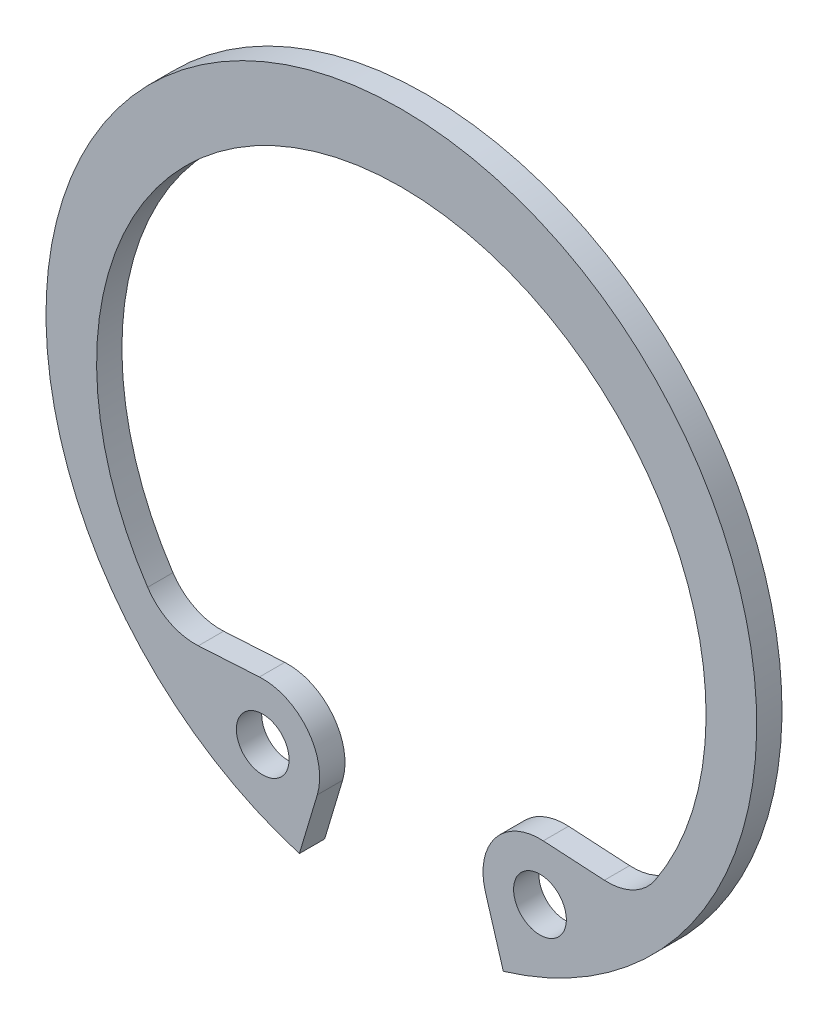
ISO-10303-21;
HEADER;
FILE_DESCRIPTION(('STEP AP214'),'2;1');
FILE_NAME('part.step','',(''),(''),'','','');
FILE_SCHEMA(('AUTOMOTIVE_DESIGN { 1 0 10303 214 1 1 1 1 }'));
ENDSEC;
DATA;
#1=APPLICATION_CONTEXT('core data for automotive mechanical design processes');
#2=APPLICATION_PROTOCOL_DEFINITION('international standard','automotive_design',2000,#1);
#3=PRODUCT_CONTEXT('',#1,'mechanical');
#4=PRODUCT('Part','Part','',(#3));
#5=PRODUCT_RELATED_PRODUCT_CATEGORY('part','',(#4));
#6=PRODUCT_DEFINITION_FORMATION('','',#4);
#7=PRODUCT_DEFINITION_CONTEXT('part definition',#1,'design');
#8=PRODUCT_DEFINITION('design','',#6,#7);
#9=PRODUCT_DEFINITION_SHAPE('','',#8);
#10=(LENGTH_UNIT() NAMED_UNIT(*) SI_UNIT(.MILLI.,.METRE.));
#11=(NAMED_UNIT(*) PLANE_ANGLE_UNIT() SI_UNIT($,.RADIAN.));
#12=(NAMED_UNIT(*) SI_UNIT($,.STERADIAN.) SOLID_ANGLE_UNIT());
#13=UNCERTAINTY_MEASURE_WITH_UNIT(LENGTH_MEASURE(1.E-05),#10,'distance_accuracy_value','');
#14=(GEOMETRIC_REPRESENTATION_CONTEXT(3) GLOBAL_UNCERTAINTY_ASSIGNED_CONTEXT((#13)) GLOBAL_UNIT_ASSIGNED_CONTEXT((#10,
#11,#12)) REPRESENTATION_CONTEXT('',''));
#15=CARTESIAN_POINT('',(0.,0.,0.));
#16=DIRECTION('',(0.,0.,1.));
#17=DIRECTION('',(1.,0.,0.));
#18=AXIS2_PLACEMENT_3D('',#15,#16,#17);
#19=CARTESIAN_POINT('',(0.,0.,0.));
#20=DIRECTION('',(0.,0.,1.));
#21=DIRECTION('',(0.999999999999999,0.,0.));
#22=AXIS2_PLACEMENT_3D('',#19,#20,#21);
#23=PLANE('',#22);
#24=CARTESIAN_POINT('',(6.57243608662109,-12.5309849527992,0.));
#25=DIRECTION('',(0.,0.,1.));
#26=DIRECTION('',(0.999999999999999,0.,0.));
#27=AXIS2_PLACEMENT_3D('',#24,#25,#26);
#28=CIRCLE('',#27,1.25);
#29=CARTESIAN_POINT('',(5.3224360866211,-12.5309849527992,0.));
#30=VERTEX_POINT('',#29);
#31=EDGE_CURVE('E130',#30,#30,#28,.T.);
#32=ORIENTED_EDGE('',*,*,#31,.T.);
#33=EDGE_LOOP('',(#32));
#34=FACE_BOUND('',#33,.T.);
#35=CARTESIAN_POINT('',(0.,0.,0.));
#36=DIRECTION('',(0.,0.,1.));
#37=DIRECTION('',(0.999999999999999,0.,0.));
#38=AXIS2_PLACEMENT_3D('',#35,#36,#37);
#39=CIRCLE('',#38,16.85);
#40=CARTESIAN_POINT('',(4.83542107768737,-16.1412887651964,0.));
#41=VERTEX_POINT('',#40);
#42=CARTESIAN_POINT('',(-4.83542107768737,-16.1412887651964,0.));
#43=VERTEX_POINT('',#42);
#44=EDGE_CURVE('E113',#41,#43,#39,.T.);
#45=ORIENTED_EDGE('',*,*,#44,.F.);
#46=DIRECTION('',(0.286968609951774,-0.957939986065069,0.));
#47=VECTOR('',#46,1.);
#48=CARTESIAN_POINT('',(3.9859981242454,-13.305800199669,0.));
#49=LINE('',#48,#47);
#50=CARTESIAN_POINT('',(3.9859981242454,-13.305800199669,0.));
#51=VERTEX_POINT('',#50);
#52=EDGE_CURVE('E147',#51,#41,#49,.T.);
#53=ORIENTED_EDGE('',*,*,#52,.F.);
#54=CARTESIAN_POINT('',(6.57243608662109,-12.5309849527992,0.));
#55=DIRECTION('',(0.,0.,1.));
#56=DIRECTION('',(0.999999999999999,0.,0.));
#57=AXIS2_PLACEMENT_3D('',#54,#55,#56);
#58=CIRCLE('',#57,2.7);
#59=CARTESIAN_POINT('',(6.72896179925984,-9.83552586364894,0.));
#60=VERTEX_POINT('',#59);
#61=EDGE_CURVE('E145',#60,#51,#58,.T.);
#62=ORIENTED_EDGE('',*,*,#61,.F.);
#63=DIRECTION('',(-0.998318181166775,0.0579724861624974,0.));
#64=VECTOR('',#63,1.);
#65=CARTESIAN_POINT('',(9.62633191884148,-10.0037765800375,0.));
#66=LINE('',#65,#64);
#67=CARTESIAN_POINT('',(9.62633191884148,-10.0037765800375,0.));
#68=VERTEX_POINT('',#67);
#69=EDGE_CURVE('E143',#68,#60,#66,.T.);
#70=ORIENTED_EDGE('',*,*,#69,.F.);
#71=CARTESIAN_POINT('',(9.78285763148023,-7.30831749088726,0.));
#72=DIRECTION('',(0.,0.,-1.));
#73=DIRECTION('',(0.999999999999999,0.,0.));
#74=AXIS2_PLACEMENT_3D('',#71,#72,#73);
#75=CIRCLE('',#74,2.7);
#76=CARTESIAN_POINT('',(12.0308334276501,-8.80384576538901,0.));
#77=VERTEX_POINT('',#76);
#78=EDGE_CURVE('E141',#77,#68,#75,.T.);
#79=ORIENTED_EDGE('',*,*,#78,.F.);
#80=CARTESIAN_POINT('',(0.,-0.799999999999995,0.));
#81=DIRECTION('',(0.,0.,-1.));
#82=DIRECTION('',(0.999999999999999,0.,0.));
#83=AXIS2_PLACEMENT_3D('',#80,#81,#82);
#84=CIRCLE('',#83,14.45);
#85=CARTESIAN_POINT('',(-12.0308334276501,-8.80384576538901,0.));
#86=VERTEX_POINT('',#85);
#87=EDGE_CURVE('E139',#86,#77,#84,.T.);
#88=ORIENTED_EDGE('',*,*,#87,.F.);
#89=CARTESIAN_POINT('',(-9.78285763148023,-7.30831749088726,0.));
#90=DIRECTION('',(0.,0.,-1.));
#91=DIRECTION('',(-0.999999999999999,0.,0.));
#92=AXIS2_PLACEMENT_3D('',#89,#90,#91);
#93=CIRCLE('',#92,2.7);
#94=CARTESIAN_POINT('',(-9.62633191884148,-10.0037765800376,0.));
#95=VERTEX_POINT('',#94);
#96=EDGE_CURVE('E137',#95,#86,#93,.T.);
#97=ORIENTED_EDGE('',*,*,#96,.F.);
#98=DIRECTION('',(-0.998318181166775,-0.0579724861624974,0.));
#99=VECTOR('',#98,1.);
#100=CARTESIAN_POINT('',(-9.62633191884148,-10.0037765800376,0.));
#101=LINE('',#100,#99);
#102=CARTESIAN_POINT('',(-6.72896179925983,-9.83552586364894,0.));
#103=VERTEX_POINT('',#102);
#104=EDGE_CURVE('E135',#103,#95,#101,.T.);
#105=ORIENTED_EDGE('',*,*,#104,.F.);
#106=CARTESIAN_POINT('',(-6.57243608662109,-12.5309849527992,0.));
#107=DIRECTION('',(0.,0.,1.));
#108=DIRECTION('',(-0.999999999999999,0.,0.));
#109=AXIS2_PLACEMENT_3D('',#106,#107,#108);
#110=CIRCLE('',#109,2.7);
#111=CARTESIAN_POINT('',(-3.98599812424541,-13.305800199669,0.));
#112=VERTEX_POINT('',#111);
#113=EDGE_CURVE('E115',#112,#103,#110,.T.);
#114=ORIENTED_EDGE('',*,*,#113,.F.);
#115=DIRECTION('',(0.286968609951774,0.957939986065069,0.));
#116=VECTOR('',#115,1.);
#117=CARTESIAN_POINT('',(-3.9859981242454,-13.305800199669,0.));
#118=LINE('',#117,#116);
#119=EDGE_CURVE('E109',#43,#112,#118,.T.);
#120=ORIENTED_EDGE('',*,*,#119,.F.);
#121=EDGE_LOOP('',(#45,#53,#62,#70,#79,#88,#97,#105,#114,#120));
#122=FACE_BOUND('',#121,.T.);
#123=CARTESIAN_POINT('',(-6.57243608662109,-12.5309849527992,0.));
#124=DIRECTION('',(0.,0.,1.));
#125=DIRECTION('',(-0.999999999999999,0.,0.));
#126=AXIS2_PLACEMENT_3D('',#123,#124,#125);
#127=CIRCLE('',#126,1.25);
#128=CARTESIAN_POINT('',(-7.82243608662109,-12.5309849527992,0.));
#129=VERTEX_POINT('',#128);
#130=EDGE_CURVE('E253',#129,#129,#127,.T.);
#131=ORIENTED_EDGE('',*,*,#130,.T.);
#132=EDGE_LOOP('',(#131));
#133=FACE_BOUND('',#132,.T.);
#134=ADVANCED_FACE('F32',(#34,#122,#133),#23,.F.);
#135=CARTESIAN_POINT('',(0.,0.,1.2));
#136=DIRECTION('',(0.,0.,1.));
#137=DIRECTION('',(0.999999999999999,0.,0.));
#138=AXIS2_PLACEMENT_3D('',#135,#136,#137);
#139=PLANE('',#138);
#140=CARTESIAN_POINT('',(6.57243608662109,-12.5309849527992,1.2));
#141=DIRECTION('',(0.,0.,1.));
#142=DIRECTION('',(0.999999999999999,0.,0.));
#143=AXIS2_PLACEMENT_3D('',#140,#141,#142);
#144=CIRCLE('',#143,1.25);
#145=CARTESIAN_POINT('',(5.3224360866211,-12.5309849527992,1.2));
#146=VERTEX_POINT('',#145);
#147=EDGE_CURVE('E127',#146,#146,#144,.T.);
#148=ORIENTED_EDGE('',*,*,#147,.F.);
#149=EDGE_LOOP('',(#148));
#150=FACE_BOUND('',#149,.T.);
#151=CARTESIAN_POINT('',(0.,0.,1.2));
#152=DIRECTION('',(0.,0.,1.));
#153=DIRECTION('',(0.999999999999999,0.,0.));
#154=AXIS2_PLACEMENT_3D('',#151,#152,#153);
#155=CIRCLE('',#154,16.85);
#156=CARTESIAN_POINT('',(4.83542107768737,-16.1412887651964,1.2));
#157=VERTEX_POINT('',#156);
#158=CARTESIAN_POINT('',(-4.83542107768737,-16.1412887651964,1.19999999999999));
#159=VERTEX_POINT('',#158);
#160=EDGE_CURVE('E149',#157,#159,#155,.T.);
#161=ORIENTED_EDGE('',*,*,#160,.T.);
#162=DIRECTION('',(0.286968609951774,0.957939986065069,0.));
#163=VECTOR('',#162,1.);
#164=CARTESIAN_POINT('',(-3.9859981242454,-13.305800199669,1.2));
#165=LINE('',#164,#163);
#166=CARTESIAN_POINT('',(-3.98599812424541,-13.305800199669,1.2));
#167=VERTEX_POINT('',#166);
#168=EDGE_CURVE('E122',#159,#167,#165,.T.);
#169=ORIENTED_EDGE('',*,*,#168,.T.);
#170=CARTESIAN_POINT('',(-6.57243608662109,-12.5309849527992,1.2));
#171=DIRECTION('',(0.,0.,1.));
#172=DIRECTION('',(-0.999999999999999,0.,0.));
#173=AXIS2_PLACEMENT_3D('',#170,#171,#172);
#174=CIRCLE('',#173,2.7);
#175=CARTESIAN_POINT('',(-6.72896179925984,-9.83552586364894,1.2));
#176=VERTEX_POINT('',#175);
#177=EDGE_CURVE('E152',#167,#176,#174,.T.);
#178=ORIENTED_EDGE('',*,*,#177,.T.);
#179=DIRECTION('',(-0.998318181166775,-0.0579724861624974,0.));
#180=VECTOR('',#179,1.);
#181=CARTESIAN_POINT('',(-9.62633191884148,-10.0037765800376,1.2));
#182=LINE('',#181,#180);
#183=CARTESIAN_POINT('',(-9.62633191884148,-10.0037765800376,1.2));
#184=VERTEX_POINT('',#183);
#185=EDGE_CURVE('E154',#176,#184,#182,.T.);
#186=ORIENTED_EDGE('',*,*,#185,.T.);
#187=CARTESIAN_POINT('',(-9.78285763148023,-7.30831749088726,1.2));
#188=DIRECTION('',(0.,0.,-1.));
#189=DIRECTION('',(-0.999999999999999,0.,0.));
#190=AXIS2_PLACEMENT_3D('',#187,#188,#189);
#191=CIRCLE('',#190,2.7);
#192=CARTESIAN_POINT('',(-12.0308334276501,-8.80384576538901,1.2));
#193=VERTEX_POINT('',#192);
#194=EDGE_CURVE('E156',#184,#193,#191,.T.);
#195=ORIENTED_EDGE('',*,*,#194,.T.);
#196=CARTESIAN_POINT('',(0.,-0.799999999999995,1.2));
#197=DIRECTION('',(0.,0.,-1.));
#198=DIRECTION('',(0.999999999999999,0.,0.));
#199=AXIS2_PLACEMENT_3D('',#196,#197,#198);
#200=CIRCLE('',#199,14.45);
#201=CARTESIAN_POINT('',(12.0308334276501,-8.80384576538901,1.2));
#202=VERTEX_POINT('',#201);
#203=EDGE_CURVE('E158',#193,#202,#200,.T.);
#204=ORIENTED_EDGE('',*,*,#203,.T.);
#205=CARTESIAN_POINT('',(9.78285763148023,-7.30831749088726,1.2));
#206=DIRECTION('',(0.,0.,-1.));
#207=DIRECTION('',(0.999999999999999,0.,0.));
#208=AXIS2_PLACEMENT_3D('',#205,#206,#207);
#209=CIRCLE('',#208,2.7);
#210=CARTESIAN_POINT('',(9.62633191884148,-10.0037765800375,1.2));
#211=VERTEX_POINT('',#210);
#212=EDGE_CURVE('E160',#202,#211,#209,.T.);
#213=ORIENTED_EDGE('',*,*,#212,.T.);
#214=DIRECTION('',(-0.998318181166775,0.0579724861624974,0.));
#215=VECTOR('',#214,1.);
#216=CARTESIAN_POINT('',(9.62633191884148,-10.0037765800375,1.2));
#217=LINE('',#216,#215);
#218=CARTESIAN_POINT('',(6.72896179925984,-9.83552586364894,1.2));
#219=VERTEX_POINT('',#218);
#220=EDGE_CURVE('E162',#211,#219,#217,.T.);
#221=ORIENTED_EDGE('',*,*,#220,.T.);
#222=CARTESIAN_POINT('',(6.57243608662109,-12.5309849527992,1.2));
#223=DIRECTION('',(0.,0.,1.));
#224=DIRECTION('',(0.999999999999999,0.,0.));
#225=AXIS2_PLACEMENT_3D('',#222,#223,#224);
#226=CIRCLE('',#225,2.7);
#227=CARTESIAN_POINT('',(3.9859981242454,-13.305800199669,1.2));
#228=VERTEX_POINT('',#227);
#229=EDGE_CURVE('E52',#219,#228,#226,.T.);
#230=ORIENTED_EDGE('',*,*,#229,.T.);
#231=DIRECTION('',(0.286968609951774,-0.957939986065069,0.));
#232=VECTOR('',#231,1.);
#233=CARTESIAN_POINT('',(3.9859981242454,-13.305800199669,1.2));
#234=LINE('',#233,#232);
#235=EDGE_CURVE('E47',#228,#157,#234,.T.);
#236=ORIENTED_EDGE('',*,*,#235,.T.);
#237=EDGE_LOOP('',(#161,#169,#178,#186,#195,#204,#213,#221,#230,#236));
#238=FACE_BOUND('',#237,.T.);
#239=CARTESIAN_POINT('',(-6.57243608662109,-12.5309849527992,1.2));
#240=DIRECTION('',(0.,0.,1.));
#241=DIRECTION('',(-0.999999999999999,0.,0.));
#242=AXIS2_PLACEMENT_3D('',#239,#240,#241);
#243=CIRCLE('',#242,1.25);
#244=CARTESIAN_POINT('',(-7.82243608662109,-12.5309849527992,1.2));
#245=VERTEX_POINT('',#244);
#246=EDGE_CURVE('E250',#245,#245,#243,.T.);
#247=ORIENTED_EDGE('',*,*,#246,.F.);
#248=EDGE_LOOP('',(#247));
#249=FACE_BOUND('',#248,.T.);
#250=ADVANCED_FACE('F192',(#150,#238,#249),#139,.T.);
#251=CARTESIAN_POINT('',(0.,0.,1.2));
#252=DIRECTION('',(0.,0.,-1.));
#253=DIRECTION('',(-0.999999999999999,0.,0.));
#254=AXIS2_PLACEMENT_3D('',#251,#252,#253);
#255=CYLINDRICAL_SURFACE('',#254,16.85);
#256=ORIENTED_EDGE('',*,*,#44,.T.);
#257=DIRECTION('',(0.,0.,-1.));
#258=VECTOR('',#257,1.);
#259=CARTESIAN_POINT('',(-4.83542107768737,-16.1412887651964,1.19999999999999));
#260=LINE('',#259,#258);
#261=EDGE_CURVE('E11',#159,#43,#260,.T.);
#262=ORIENTED_EDGE('',*,*,#261,.F.);
#263=ORIENTED_EDGE('',*,*,#160,.F.);
#264=DIRECTION('',(0.,0.,-1.));
#265=VECTOR('',#264,1.);
#266=CARTESIAN_POINT('',(4.83542107768737,-16.1412887651964,1.2));
#267=LINE('',#266,#265);
#268=EDGE_CURVE('E126',#157,#41,#267,.T.);
#269=ORIENTED_EDGE('',*,*,#268,.T.);
#270=EDGE_LOOP('',(#256,#262,#263,#269));
#271=FACE_BOUND('',#270,.T.);
#272=ADVANCED_FACE('F34',(#271),#255,.T.);
#273=CARTESIAN_POINT('',(-3.9859981242454,-13.305800199669,1.2));
#274=DIRECTION('',(-0.957939986065069,0.286968609951774,0.));
#275=DIRECTION('',(-0.286968609951774,-0.95793998606507,0.));
#276=AXIS2_PLACEMENT_3D('',#273,#274,#275);
#277=PLANE('',#276);
#278=ORIENTED_EDGE('',*,*,#119,.T.);
#279=DIRECTION('',(0.,0.,-1.));
#280=VECTOR('',#279,1.);
#281=CARTESIAN_POINT('',(-3.98599812424541,-13.305800199669,1.2));
#282=LINE('',#281,#280);
#283=EDGE_CURVE('E40',#167,#112,#282,.T.);
#284=ORIENTED_EDGE('',*,*,#283,.F.);
#285=ORIENTED_EDGE('',*,*,#168,.F.);
#286=ORIENTED_EDGE('',*,*,#261,.T.);
#287=EDGE_LOOP('',(#278,#284,#285,#286));
#288=FACE_BOUND('',#287,.T.);
#289=ADVANCED_FACE('F121',(#288),#277,.F.);
#290=CARTESIAN_POINT('',(-6.57243608662109,-12.5309849527992,1.2));
#291=DIRECTION('',(0.,0.,-1.));
#292=DIRECTION('',(-0.999999999999999,0.,0.));
#293=AXIS2_PLACEMENT_3D('',#290,#291,#292);
#294=CYLINDRICAL_SURFACE('',#293,2.7);
#295=ORIENTED_EDGE('',*,*,#113,.T.);
#296=DIRECTION('',(0.,0.,-1.));
#297=VECTOR('',#296,1.);
#298=CARTESIAN_POINT('',(-6.72896179925984,-9.83552586364894,1.2));
#299=LINE('',#298,#297);
#300=EDGE_CURVE('E185',#176,#103,#299,.T.);
#301=ORIENTED_EDGE('',*,*,#300,.F.);
#302=ORIENTED_EDGE('',*,*,#177,.F.);
#303=ORIENTED_EDGE('',*,*,#283,.T.);
#304=EDGE_LOOP('',(#295,#301,#302,#303));
#305=FACE_BOUND('',#304,.T.);
#306=ADVANCED_FACE('F189',(#305),#294,.T.);
#307=CARTESIAN_POINT('',(-9.62633191884148,-10.0037765800376,1.2));
#308=DIRECTION('',(0.0579724861624974,-0.998318181166775,0.));
#309=DIRECTION('',(0.998318181166775,0.0579724861624974,0.));
#310=AXIS2_PLACEMENT_3D('',#307,#308,#309);
#311=PLANE('',#310);
#312=ORIENTED_EDGE('',*,*,#104,.T.);
#313=DIRECTION('',(0.,0.,-1.));
#314=VECTOR('',#313,1.);
#315=CARTESIAN_POINT('',(-9.62633191884148,-10.0037765800376,1.2));
#316=LINE('',#315,#314);
#317=EDGE_CURVE('E182',#184,#95,#316,.T.);
#318=ORIENTED_EDGE('',*,*,#317,.F.);
#319=ORIENTED_EDGE('',*,*,#185,.F.);
#320=ORIENTED_EDGE('',*,*,#300,.T.);
#321=EDGE_LOOP('',(#312,#318,#319,#320));
#322=FACE_BOUND('',#321,.T.);
#323=ADVANCED_FACE('F198',(#322),#311,.F.);
#324=CARTESIAN_POINT('',(-9.78285763148023,-7.30831749088726,1.2));
#325=DIRECTION('',(0.,0.,-1.));
#326=DIRECTION('',(-0.999999999999999,0.,0.));
#327=AXIS2_PLACEMENT_3D('',#324,#325,#326);
#328=CYLINDRICAL_SURFACE('',#327,2.7);
#329=ORIENTED_EDGE('',*,*,#96,.T.);
#330=DIRECTION('',(0.,0.,-1.));
#331=VECTOR('',#330,1.);
#332=CARTESIAN_POINT('',(-12.0308334276501,-8.80384576538901,1.2));
#333=LINE('',#332,#331);
#334=EDGE_CURVE('E179',#193,#86,#333,.T.);
#335=ORIENTED_EDGE('',*,*,#334,.F.);
#336=ORIENTED_EDGE('',*,*,#194,.F.);
#337=ORIENTED_EDGE('',*,*,#317,.T.);
#338=EDGE_LOOP('',(#329,#335,#336,#337));
#339=FACE_BOUND('',#338,.T.);
#340=ADVANCED_FACE('F201',(#339),#328,.F.);
#341=CARTESIAN_POINT('',(0.,-0.799999999999995,1.2));
#342=DIRECTION('',(0.,0.,-1.));
#343=DIRECTION('',(-0.999999999999999,0.,0.));
#344=AXIS2_PLACEMENT_3D('',#341,#342,#343);
#345=CYLINDRICAL_SURFACE('',#344,14.45);
#346=ORIENTED_EDGE('',*,*,#87,.T.);
#347=DIRECTION('',(0.,0.,-1.));
#348=VECTOR('',#347,1.);
#349=CARTESIAN_POINT('',(12.0308334276501,-8.80384576538901,1.2));
#350=LINE('',#349,#348);
#351=EDGE_CURVE('E176',#202,#77,#350,.T.);
#352=ORIENTED_EDGE('',*,*,#351,.F.);
#353=ORIENTED_EDGE('',*,*,#203,.F.);
#354=ORIENTED_EDGE('',*,*,#334,.T.);
#355=EDGE_LOOP('',(#346,#352,#353,#354));
#356=FACE_BOUND('',#355,.T.);
#357=ADVANCED_FACE('F206',(#356),#345,.F.);
#358=CARTESIAN_POINT('',(9.78285763148023,-7.30831749088726,1.2));
#359=DIRECTION('',(0.,0.,-1.));
#360=DIRECTION('',(-0.999999999999999,0.,0.));
#361=AXIS2_PLACEMENT_3D('',#358,#359,#360);
#362=CYLINDRICAL_SURFACE('',#361,2.7);
#363=ORIENTED_EDGE('',*,*,#78,.T.);
#364=DIRECTION('',(0.,0.,-1.));
#365=VECTOR('',#364,1.);
#366=CARTESIAN_POINT('',(9.62633191884148,-10.0037765800375,1.2));
#367=LINE('',#366,#365);
#368=EDGE_CURVE('E173',#211,#68,#367,.T.);
#369=ORIENTED_EDGE('',*,*,#368,.F.);
#370=ORIENTED_EDGE('',*,*,#212,.F.);
#371=ORIENTED_EDGE('',*,*,#351,.T.);
#372=EDGE_LOOP('',(#363,#369,#370,#371));
#373=FACE_BOUND('',#372,.T.);
#374=ADVANCED_FACE('F212',(#373),#362,.F.);
#375=CARTESIAN_POINT('',(9.62633191884148,-10.0037765800375,1.2));
#376=DIRECTION('',(-0.0579724861624974,-0.998318181166775,0.));
#377=DIRECTION('',(0.998318181166775,-0.0579724861624974,0.));
#378=AXIS2_PLACEMENT_3D('',#375,#376,#377);
#379=PLANE('',#378);
#380=ORIENTED_EDGE('',*,*,#69,.T.);
#381=DIRECTION('',(0.,0.,-1.));
#382=VECTOR('',#381,1.);
#383=CARTESIAN_POINT('',(6.72896179925984,-9.83552586364894,1.2));
#384=LINE('',#383,#382);
#385=EDGE_CURVE('E170',#219,#60,#384,.T.);
#386=ORIENTED_EDGE('',*,*,#385,.F.);
#387=ORIENTED_EDGE('',*,*,#220,.F.);
#388=ORIENTED_EDGE('',*,*,#368,.T.);
#389=EDGE_LOOP('',(#380,#386,#387,#388));
#390=FACE_BOUND('',#389,.T.);
#391=ADVANCED_FACE('F216',(#390),#379,.F.);
#392=CARTESIAN_POINT('',(6.57243608662109,-12.5309849527992,1.2));
#393=DIRECTION('',(0.,0.,-1.));
#394=DIRECTION('',(-0.999999999999999,0.,0.));
#395=AXIS2_PLACEMENT_3D('',#392,#393,#394);
#396=CYLINDRICAL_SURFACE('',#395,2.7);
#397=ORIENTED_EDGE('',*,*,#61,.T.);
#398=DIRECTION('',(0.,0.,-1.));
#399=VECTOR('',#398,1.);
#400=CARTESIAN_POINT('',(3.9859981242454,-13.305800199669,1.2));
#401=LINE('',#400,#399);
#402=EDGE_CURVE('E167',#228,#51,#401,.T.);
#403=ORIENTED_EDGE('',*,*,#402,.F.);
#404=ORIENTED_EDGE('',*,*,#229,.F.);
#405=ORIENTED_EDGE('',*,*,#385,.T.);
#406=EDGE_LOOP('',(#397,#403,#404,#405));
#407=FACE_BOUND('',#406,.T.);
#408=ADVANCED_FACE('F219',(#407),#396,.T.);
#409=CARTESIAN_POINT('',(3.9859981242454,-13.305800199669,1.2));
#410=DIRECTION('',(0.957939986065069,0.286968609951774,0.));
#411=DIRECTION('',(-0.286968609951774,0.95793998606507,0.));
#412=AXIS2_PLACEMENT_3D('',#409,#410,#411);
#413=PLANE('',#412);
#414=ORIENTED_EDGE('',*,*,#52,.T.);
#415=ORIENTED_EDGE('',*,*,#268,.F.);
#416=ORIENTED_EDGE('',*,*,#235,.F.);
#417=ORIENTED_EDGE('',*,*,#402,.T.);
#418=EDGE_LOOP('',(#414,#415,#416,#417));
#419=FACE_BOUND('',#418,.T.);
#420=ADVANCED_FACE('F221',(#419),#413,.F.);
#421=CARTESIAN_POINT('',(6.57243608662109,-12.5309849527992,1.2));
#422=DIRECTION('',(0.,0.,-1.));
#423=DIRECTION('',(-0.999999999999999,0.,0.));
#424=AXIS2_PLACEMENT_3D('',#421,#422,#423);
#425=CYLINDRICAL_SURFACE('',#424,1.25);
#426=CARTESIAN_POINT('',(5.3224360866211,-12.5309849527992,1.2));
#427=CARTESIAN_POINT('',(5.3224360866211,-12.5309849527992,1.1875));
#428=CARTESIAN_POINT('',(5.3224360866211,-12.5309849527992,1.175));
#429=CARTESIAN_POINT('',(5.3224360866211,-12.5309849527992,1.15));
#430=CARTESIAN_POINT('',(5.3224360866211,-12.5309849527992,1.1375));
#431=CARTESIAN_POINT('',(5.3224360866211,-12.5309849527992,1.1125));
#432=CARTESIAN_POINT('',(5.3224360866211,-12.5309849527992,1.1));
#433=CARTESIAN_POINT('',(5.3224360866211,-12.5309849527992,1.075));
#434=CARTESIAN_POINT('',(5.3224360866211,-12.5309849527992,1.0625));
#435=CARTESIAN_POINT('',(5.3224360866211,-12.5309849527992,1.0375));
#436=CARTESIAN_POINT('',(5.3224360866211,-12.5309849527992,1.025));
#437=CARTESIAN_POINT('',(5.3224360866211,-12.5309849527992,0.999999999999996));
#438=CARTESIAN_POINT('',(5.3224360866211,-12.5309849527992,0.987499999999996));
#439=CARTESIAN_POINT('',(5.3224360866211,-12.5309849527992,0.962499999999996));
#440=CARTESIAN_POINT('',(5.3224360866211,-12.5309849527992,0.949999999999996));
#441=CARTESIAN_POINT('',(5.3224360866211,-12.5309849527992,0.924999999999996));
#442=CARTESIAN_POINT('',(5.3224360866211,-12.5309849527992,0.912499999999996));
#443=CARTESIAN_POINT('',(5.3224360866211,-12.5309849527992,0.887499999999996));
#444=CARTESIAN_POINT('',(5.3224360866211,-12.5309849527992,0.874999999999996));
#445=CARTESIAN_POINT('',(5.3224360866211,-12.5309849527992,0.849999999999996));
#446=CARTESIAN_POINT('',(5.3224360866211,-12.5309849527992,0.837499999999996));
#447=CARTESIAN_POINT('',(5.3224360866211,-12.5309849527992,0.812499999999996));
#448=CARTESIAN_POINT('',(5.3224360866211,-12.5309849527992,0.799999999999996));
#449=CARTESIAN_POINT('',(5.3224360866211,-12.5309849527992,0.774999999999996));
#450=CARTESIAN_POINT('',(5.3224360866211,-12.5309849527992,0.762499999999996));
#451=CARTESIAN_POINT('',(5.3224360866211,-12.5309849527992,0.737499999999996));
#452=CARTESIAN_POINT('',(5.3224360866211,-12.5309849527992,0.724999999999996));
#453=CARTESIAN_POINT('',(5.3224360866211,-12.5309849527992,0.699999999999996));
#454=CARTESIAN_POINT('',(5.3224360866211,-12.5309849527992,0.687499999999996));
#455=CARTESIAN_POINT('',(5.3224360866211,-12.5309849527992,0.662499999999996));
#456=CARTESIAN_POINT('',(5.3224360866211,-12.5309849527992,0.649999999999996));
#457=CARTESIAN_POINT('',(5.3224360866211,-12.5309849527992,0.624999999999996));
#458=CARTESIAN_POINT('',(5.3224360866211,-12.5309849527992,0.612499999999996));
#459=CARTESIAN_POINT('',(5.3224360866211,-12.5309849527992,0.587499999999996));
#460=CARTESIAN_POINT('',(5.3224360866211,-12.5309849527992,0.574999999999996));
#461=CARTESIAN_POINT('',(5.3224360866211,-12.5309849527992,0.549999999999996));
#462=CARTESIAN_POINT('',(5.3224360866211,-12.5309849527992,0.537499999999996));
#463=CARTESIAN_POINT('',(5.3224360866211,-12.5309849527992,0.512499999999996));
#464=CARTESIAN_POINT('',(5.3224360866211,-12.5309849527992,0.499999999999996));
#465=CARTESIAN_POINT('',(5.3224360866211,-12.5309849527992,0.474999999999996));
#466=CARTESIAN_POINT('',(5.3224360866211,-12.5309849527992,0.462499999999996));
#467=CARTESIAN_POINT('',(5.3224360866211,-12.5309849527992,0.437499999999996));
#468=CARTESIAN_POINT('',(5.3224360866211,-12.5309849527992,0.424999999999996));
#469=CARTESIAN_POINT('',(5.3224360866211,-12.5309849527992,0.399999999999996));
#470=CARTESIAN_POINT('',(5.3224360866211,-12.5309849527992,0.387499999999996));
#471=CARTESIAN_POINT('',(5.3224360866211,-12.5309849527992,0.362499999999996));
#472=CARTESIAN_POINT('',(5.3224360866211,-12.5309849527992,0.349999999999996));
#473=CARTESIAN_POINT('',(5.3224360866211,-12.5309849527992,0.324999999999996));
#474=CARTESIAN_POINT('',(5.3224360866211,-12.5309849527992,0.312499999999996));
#475=CARTESIAN_POINT('',(5.3224360866211,-12.5309849527992,0.287499999999996));
#476=CARTESIAN_POINT('',(5.3224360866211,-12.5309849527992,0.274999999999996));
#477=CARTESIAN_POINT('',(5.3224360866211,-12.5309849527992,0.249999999999996));
#478=CARTESIAN_POINT('',(5.3224360866211,-12.5309849527992,0.237499999999996));
#479=CARTESIAN_POINT('',(5.3224360866211,-12.5309849527992,0.212499999999996));
#480=CARTESIAN_POINT('',(5.3224360866211,-12.5309849527992,0.199999999999996));
#481=CARTESIAN_POINT('',(5.3224360866211,-12.5309849527992,0.174999999999996));
#482=CARTESIAN_POINT('',(5.3224360866211,-12.5309849527992,0.162499999999997));
#483=CARTESIAN_POINT('',(5.3224360866211,-12.5309849527992,0.137499999999996));
#484=CARTESIAN_POINT('',(5.3224360866211,-12.5309849527992,0.124999999999997));
#485=CARTESIAN_POINT('',(5.3224360866211,-12.5309849527992,0.0999999999999965));
#486=CARTESIAN_POINT('',(5.3224360866211,-12.5309849527992,0.0874999999999965));
#487=CARTESIAN_POINT('',(5.3224360866211,-12.5309849527992,0.0624999999999965));
#488=CARTESIAN_POINT('',(5.3224360866211,-12.5309849527992,0.0499999999999965));
#489=CARTESIAN_POINT('',(5.3224360866211,-12.5309849527992,0.0249999999999965));
#490=CARTESIAN_POINT('',(5.3224360866211,-12.5309849527992,0.0124999999999965));
#491=CARTESIAN_POINT('',(5.3224360866211,-12.5309849527992,0.));
#492=B_SPLINE_CURVE_WITH_KNOTS('',3,(#426,#427,#428,#429,#430,#431,#432,#433,#434,#435,#436,
#437,#438,#439,#440,#441,#442,#443,#444,#445,#446,#447,#448,#449,#450,#451,#452,#453,#454,#455,
#456,#457,#458,#459,#460,#461,#462,#463,#464,#465,#466,#467,#468,#469,#470,#471,#472,#473,#474,
#475,#476,#477,#478,#479,#480,#481,#482,#483,#484,#485,#486,#487,#488,#489,#490,#491),
.UNSPECIFIED.,.F.,.F.,(4,2,2,2,2,2,2,2,2,2,2,2,2,2,2,2,2,2,2,2,2,2,2,2,2,2,2,2,2,2,2,2,4),(0.,
0.0375000000000002,0.075,0.1125,0.15,0.1875,0.225,0.2625,0.3,0.3375,0.375,0.4125,0.45,0.4875,
0.525,0.5625,0.6,0.6375,0.675,0.7125,0.75,0.7875,0.825,0.8625,0.9,0.9375,0.975,1.0125,1.05,
1.0875,1.125,1.1625,1.2),.UNSPECIFIED.);
#493=EDGE_CURVE('BSEAM223',#146,#30,#492,.T.);
#494=ORIENTED_EDGE('',*,*,#147,.T.);
#495=ORIENTED_EDGE('',*,*,#31,.F.);
#496=ORIENTED_EDGE('',*,*,#493,.T.);
#497=ORIENTED_EDGE('',*,*,#493,.F.);
#498=EDGE_LOOP('',(#494,#496,#495,#497));
#499=FACE_BOUND('',#498,.T.);
#500=ADVANCED_FACE('F223',(#499),#425,.F.);
#501=CARTESIAN_POINT('',(-6.57243608662109,-12.5309849527992,1.2));
#502=DIRECTION('',(0.,0.,-1.));
#503=DIRECTION('',(-0.999999999999999,0.,0.));
#504=AXIS2_PLACEMENT_3D('',#501,#502,#503);
#505=CYLINDRICAL_SURFACE('',#504,1.25);
#506=CARTESIAN_POINT('',(-7.82243608662109,-12.5309849527992,1.2));
#507=CARTESIAN_POINT('',(-7.82243608662109,-12.5309849527992,1.1875));
#508=CARTESIAN_POINT('',(-7.82243608662109,-12.5309849527992,1.175));
#509=CARTESIAN_POINT('',(-7.82243608662109,-12.5309849527992,1.15));
#510=CARTESIAN_POINT('',(-7.82243608662109,-12.5309849527992,1.1375));
#511=CARTESIAN_POINT('',(-7.82243608662109,-12.5309849527992,1.1125));
#512=CARTESIAN_POINT('',(-7.82243608662109,-12.5309849527992,1.1));
#513=CARTESIAN_POINT('',(-7.82243608662109,-12.5309849527992,1.075));
#514=CARTESIAN_POINT('',(-7.82243608662109,-12.5309849527992,1.0625));
#515=CARTESIAN_POINT('',(-7.82243608662109,-12.5309849527992,1.0375));
#516=CARTESIAN_POINT('',(-7.82243608662109,-12.5309849527992,1.025));
#517=CARTESIAN_POINT('',(-7.82243608662109,-12.5309849527992,0.999999999999996));
#518=CARTESIAN_POINT('',(-7.82243608662109,-12.5309849527992,0.987499999999996));
#519=CARTESIAN_POINT('',(-7.82243608662109,-12.5309849527992,0.962499999999996));
#520=CARTESIAN_POINT('',(-7.82243608662109,-12.5309849527992,0.949999999999996));
#521=CARTESIAN_POINT('',(-7.82243608662109,-12.5309849527992,0.924999999999996));
#522=CARTESIAN_POINT('',(-7.82243608662109,-12.5309849527992,0.912499999999996));
#523=CARTESIAN_POINT('',(-7.82243608662109,-12.5309849527992,0.887499999999996));
#524=CARTESIAN_POINT('',(-7.82243608662109,-12.5309849527992,0.874999999999996));
#525=CARTESIAN_POINT('',(-7.82243608662109,-12.5309849527992,0.849999999999996));
#526=CARTESIAN_POINT('',(-7.82243608662109,-12.5309849527992,0.837499999999996));
#527=CARTESIAN_POINT('',(-7.82243608662109,-12.5309849527992,0.812499999999996));
#528=CARTESIAN_POINT('',(-7.82243608662109,-12.5309849527992,0.799999999999996));
#529=CARTESIAN_POINT('',(-7.82243608662109,-12.5309849527992,0.774999999999996));
#530=CARTESIAN_POINT('',(-7.82243608662109,-12.5309849527992,0.762499999999996));
#531=CARTESIAN_POINT('',(-7.82243608662109,-12.5309849527992,0.737499999999996));
#532=CARTESIAN_POINT('',(-7.82243608662109,-12.5309849527992,0.724999999999996));
#533=CARTESIAN_POINT('',(-7.82243608662109,-12.5309849527992,0.699999999999996));
#534=CARTESIAN_POINT('',(-7.82243608662109,-12.5309849527992,0.687499999999996));
#535=CARTESIAN_POINT('',(-7.82243608662109,-12.5309849527992,0.662499999999996));
#536=CARTESIAN_POINT('',(-7.82243608662109,-12.5309849527992,0.649999999999996));
#537=CARTESIAN_POINT('',(-7.82243608662109,-12.5309849527992,0.624999999999996));
#538=CARTESIAN_POINT('',(-7.82243608662109,-12.5309849527992,0.612499999999996));
#539=CARTESIAN_POINT('',(-7.82243608662109,-12.5309849527992,0.587499999999996));
#540=CARTESIAN_POINT('',(-7.82243608662109,-12.5309849527992,0.574999999999996));
#541=CARTESIAN_POINT('',(-7.82243608662109,-12.5309849527992,0.549999999999996));
#542=CARTESIAN_POINT('',(-7.82243608662109,-12.5309849527992,0.537499999999996));
#543=CARTESIAN_POINT('',(-7.82243608662109,-12.5309849527992,0.512499999999996));
#544=CARTESIAN_POINT('',(-7.82243608662109,-12.5309849527992,0.499999999999996));
#545=CARTESIAN_POINT('',(-7.82243608662109,-12.5309849527992,0.474999999999996));
#546=CARTESIAN_POINT('',(-7.82243608662109,-12.5309849527992,0.462499999999996));
#547=CARTESIAN_POINT('',(-7.82243608662109,-12.5309849527992,0.437499999999996));
#548=CARTESIAN_POINT('',(-7.82243608662109,-12.5309849527992,0.424999999999996));
#549=CARTESIAN_POINT('',(-7.82243608662109,-12.5309849527992,0.399999999999996));
#550=CARTESIAN_POINT('',(-7.82243608662109,-12.5309849527992,0.387499999999996));
#551=CARTESIAN_POINT('',(-7.82243608662109,-12.5309849527992,0.362499999999996));
#552=CARTESIAN_POINT('',(-7.82243608662109,-12.5309849527992,0.349999999999996));
#553=CARTESIAN_POINT('',(-7.82243608662109,-12.5309849527992,0.324999999999996));
#554=CARTESIAN_POINT('',(-7.82243608662109,-12.5309849527992,0.312499999999996));
#555=CARTESIAN_POINT('',(-7.82243608662109,-12.5309849527992,0.287499999999996));
#556=CARTESIAN_POINT('',(-7.82243608662109,-12.5309849527992,0.274999999999996));
#557=CARTESIAN_POINT('',(-7.82243608662109,-12.5309849527992,0.249999999999996));
#558=CARTESIAN_POINT('',(-7.82243608662109,-12.5309849527992,0.237499999999996));
#559=CARTESIAN_POINT('',(-7.82243608662109,-12.5309849527992,0.212499999999996));
#560=CARTESIAN_POINT('',(-7.82243608662109,-12.5309849527992,0.199999999999996));
#561=CARTESIAN_POINT('',(-7.82243608662109,-12.5309849527992,0.174999999999996));
#562=CARTESIAN_POINT('',(-7.82243608662109,-12.5309849527992,0.162499999999997));
#563=CARTESIAN_POINT('',(-7.82243608662109,-12.5309849527992,0.137499999999996));
#564=CARTESIAN_POINT('',(-7.82243608662109,-12.5309849527992,0.124999999999997));
#565=CARTESIAN_POINT('',(-7.82243608662109,-12.5309849527992,0.0999999999999965));
#566=CARTESIAN_POINT('',(-7.82243608662109,-12.5309849527992,0.0874999999999965));
#567=CARTESIAN_POINT('',(-7.82243608662109,-12.5309849527992,0.0624999999999965));
#568=CARTESIAN_POINT('',(-7.82243608662109,-12.5309849527992,0.0499999999999965));
#569=CARTESIAN_POINT('',(-7.82243608662109,-12.5309849527992,0.0249999999999965));
#570=CARTESIAN_POINT('',(-7.82243608662109,-12.5309849527992,0.0124999999999965));
#571=CARTESIAN_POINT('',(-7.82243608662109,-12.5309849527992,0.));
#572=B_SPLINE_CURVE_WITH_KNOTS('',3,(#506,#507,#508,#509,#510,#511,#512,#513,#514,#515,#516,
#517,#518,#519,#520,#521,#522,#523,#524,#525,#526,#527,#528,#529,#530,#531,#532,#533,#534,#535,
#536,#537,#538,#539,#540,#541,#542,#543,#544,#545,#546,#547,#548,#549,#550,#551,#552,#553,#554,
#555,#556,#557,#558,#559,#560,#561,#562,#563,#564,#565,#566,#567,#568,#569,#570,#571),
.UNSPECIFIED.,.F.,.F.,(4,2,2,2,2,2,2,2,2,2,2,2,2,2,2,2,2,2,2,2,2,2,2,2,2,2,2,2,2,2,2,2,4),(0.,
0.0375000000000002,0.075,0.1125,0.15,0.1875,0.225,0.2625,0.3,0.3375,0.375,0.4125,0.45,0.4875,
0.525,0.5625,0.6,0.6375,0.675,0.7125,0.75,0.7875,0.825,0.8625,0.9,0.9375,0.975,1.0125,1.05,
1.0875,1.125,1.1625,1.2),.UNSPECIFIED.);
#573=EDGE_CURVE('BSEAM229',#245,#129,#572,.T.);
#574=ORIENTED_EDGE('',*,*,#246,.T.);
#575=ORIENTED_EDGE('',*,*,#130,.F.);
#576=ORIENTED_EDGE('',*,*,#573,.T.);
#577=ORIENTED_EDGE('',*,*,#573,.F.);
#578=EDGE_LOOP('',(#574,#576,#575,#577));
#579=FACE_BOUND('',#578,.T.);
#580=ADVANCED_FACE('F229',(#579),#505,.F.);
#581=CLOSED_SHELL('',(#134,#250,#272,#289,#306,#323,#340,#357,#374,#391,#408,#420,#500,#580));
#582=MANIFOLD_SOLID_BREP('B2',#581);
#583=ADVANCED_BREP_SHAPE_REPRESENTATION('',(#18,#582),#14);
#584=SHAPE_DEFINITION_REPRESENTATION(#9,#583);
ENDSEC;
END-ISO-10303-21;
